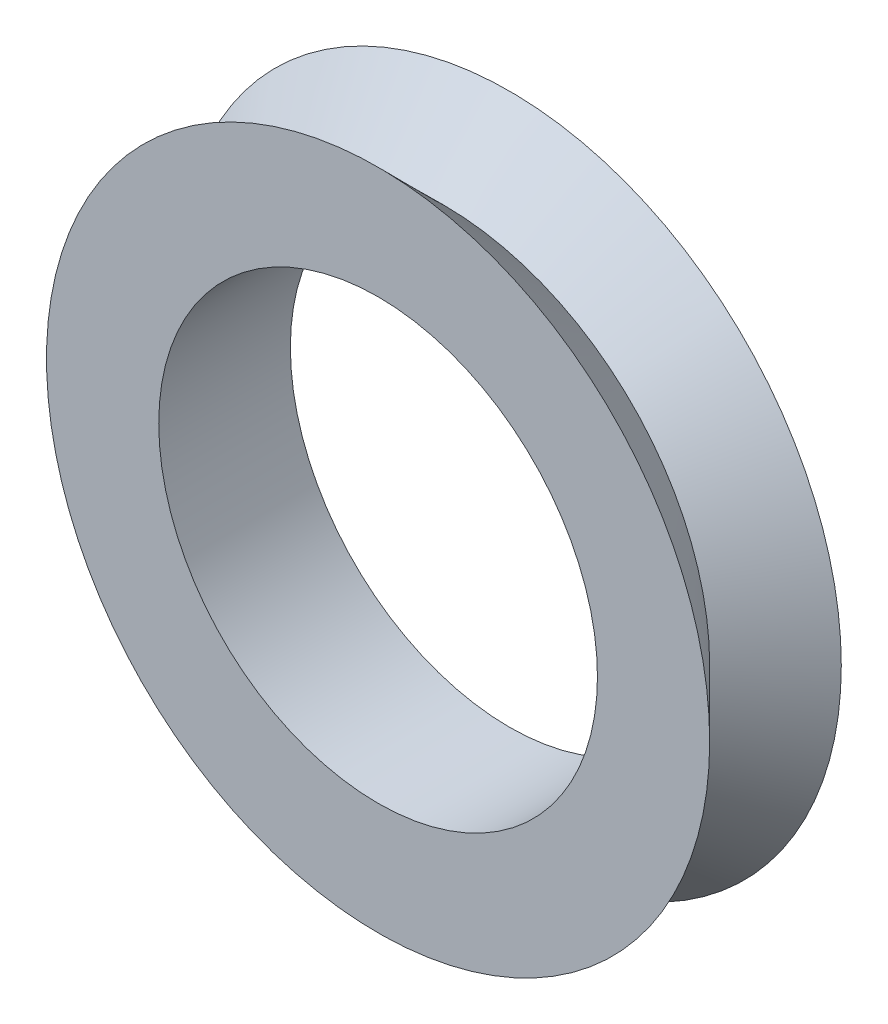
ISO-10303-21;
HEADER;
FILE_DESCRIPTION(('STEP AP214'),'2;1');
FILE_NAME('part.step','',(''),(''),'','','');
FILE_SCHEMA(('AUTOMOTIVE_DESIGN { 1 0 10303 214 1 1 1 1 }'));
ENDSEC;
DATA;
#1=APPLICATION_CONTEXT('core data for automotive mechanical design processes');
#2=APPLICATION_PROTOCOL_DEFINITION('international standard','automotive_design',2000,#1);
#3=PRODUCT_CONTEXT('',#1,'mechanical');
#4=PRODUCT('Part','Part','',(#3));
#5=PRODUCT_RELATED_PRODUCT_CATEGORY('part','',(#4));
#6=PRODUCT_DEFINITION_FORMATION('','',#4);
#7=PRODUCT_DEFINITION_CONTEXT('part definition',#1,'design');
#8=PRODUCT_DEFINITION('design','',#6,#7);
#9=PRODUCT_DEFINITION_SHAPE('','',#8);
#10=(LENGTH_UNIT() NAMED_UNIT(*) SI_UNIT(.MILLI.,.METRE.));
#11=(NAMED_UNIT(*) PLANE_ANGLE_UNIT() SI_UNIT($,.RADIAN.));
#12=(NAMED_UNIT(*) SI_UNIT($,.STERADIAN.) SOLID_ANGLE_UNIT());
#13=UNCERTAINTY_MEASURE_WITH_UNIT(LENGTH_MEASURE(1.E-05),#10,'distance_accuracy_value','');
#14=(GEOMETRIC_REPRESENTATION_CONTEXT(3) GLOBAL_UNCERTAINTY_ASSIGNED_CONTEXT((#13)) GLOBAL_UNIT_ASSIGNED_CONTEXT((#10,
#11,#12)) REPRESENTATION_CONTEXT('',''));
#15=CARTESIAN_POINT('',(0.,0.,0.));
#16=DIRECTION('',(0.,0.,1.));
#17=DIRECTION('',(1.,0.,0.));
#18=AXIS2_PLACEMENT_3D('',#15,#16,#17);
#19=CARTESIAN_POINT('',(0.,0.,4.5));
#20=DIRECTION('',(0.,0.,-1.));
#21=DIRECTION('',(-1.,0.,0.));
#22=AXIS2_PLACEMENT_3D('',#19,#20,#21);
#23=PLANE('',#22);
#24=CARTESIAN_POINT('',(0.,0.,4.5));
#25=DIRECTION('',(0.,0.,1.));
#26=DIRECTION('',(1.,0.,0.));
#27=AXIS2_PLACEMENT_3D('',#24,#25,#26);
#28=CIRCLE('',#27,15.);
#29=CARTESIAN_POINT('',(15.,0.,4.5));
#30=VERTEX_POINT('',#29);
#31=EDGE_CURVE('E10',#30,#30,#28,.T.);
#32=ORIENTED_EDGE('',*,*,#31,.F.);
#33=EDGE_LOOP('',(#32));
#34=FACE_BOUND('',#33,.T.);
#35=CARTESIAN_POINT('',(0.,0.,4.5));
#36=DIRECTION('',(0.,0.,1.));
#37=DIRECTION('',(1.,0.,0.));
#38=AXIS2_PLACEMENT_3D('',#35,#36,#37);
#39=CIRCLE('',#38,22.6749999999999);
#40=CARTESIAN_POINT('',(22.6749999999999,0.,4.5));
#41=VERTEX_POINT('',#40);
#42=EDGE_CURVE('E52',#41,#41,#39,.T.);
#43=ORIENTED_EDGE('',*,*,#42,.T.);
#44=EDGE_LOOP('',(#43));
#45=FACE_BOUND('',#44,.T.);
#46=ADVANCED_FACE('F33',(#34,#45),#23,.F.);
#47=CARTESIAN_POINT('',(0.,0.,-6.58007714250792));
#48=DIRECTION('',(0.,0.,1.));
#49=DIRECTION('',(1.,0.,0.));
#50=AXIS2_PLACEMENT_3D('',#47,#48,#49);
#51=CYLINDRICAL_SURFACE('',#50,15.);
#52=CARTESIAN_POINT('',(0.,0.,-4.5));
#53=DIRECTION('',(0.,0.,1.));
#54=DIRECTION('',(1.,0.,0.));
#55=AXIS2_PLACEMENT_3D('',#52,#53,#54);
#56=CIRCLE('',#55,15.);
#57=CARTESIAN_POINT('',(15.,0.,-4.5));
#58=VERTEX_POINT('',#57);
#59=EDGE_CURVE('E39',#58,#58,#56,.T.);
#60=ORIENTED_EDGE('',*,*,#59,.F.);
#61=EDGE_LOOP('',(#60));
#62=FACE_BOUND('',#61,.T.);
#63=ORIENTED_EDGE('',*,*,#31,.T.);
#64=EDGE_LOOP('',(#63));
#65=FACE_BOUND('',#64,.T.);
#66=ADVANCED_FACE('F71',(#62,#65),#51,.F.);
#67=CARTESIAN_POINT('',(0.,0.,-4.5));
#68=DIRECTION('',(0.,0.,1.));
#69=DIRECTION('',(1.,0.,0.));
#70=AXIS2_PLACEMENT_3D('',#67,#68,#69);
#71=PLANE('',#70);
#72=CARTESIAN_POINT('',(0.,0.,-4.5));
#73=DIRECTION('',(0.,0.,1.));
#74=DIRECTION('',(1.,0.,0.));
#75=AXIS2_PLACEMENT_3D('',#72,#73,#74);
#76=CIRCLE('',#75,22.6749999999999);
#77=CARTESIAN_POINT('',(22.6749999999999,0.,-4.5));
#78=VERTEX_POINT('',#77);
#79=EDGE_CURVE('E43',#78,#78,#76,.T.);
#80=ORIENTED_EDGE('',*,*,#79,.F.);
#81=EDGE_LOOP('',(#80));
#82=FACE_BOUND('',#81,.T.);
#83=ORIENTED_EDGE('',*,*,#59,.T.);
#84=EDGE_LOOP('',(#83));
#85=FACE_BOUND('',#84,.T.);
#86=ADVANCED_FACE('F65',(#82,#85),#71,.F.);
#87=CARTESIAN_POINT('',(0.,0.,0.));
#88=DIRECTION('',(0.,0.,-1.));
#89=DIRECTION('',(-1.,0.,0.));
#90=AXIS2_PLACEMENT_3D('',#87,#88,#89);
#91=CONICAL_SURFACE('',#90,18.175,0.785398163397443);
#92=ORIENTED_EDGE('',*,*,#79,.T.);
#93=EDGE_LOOP('',(#92));
#94=FACE_BOUND('',#93,.T.);
#95=CARTESIAN_POINT('',(0.,0.,0.));
#96=DIRECTION('',(0.,0.,1.));
#97=DIRECTION('',(1.,0.,0.));
#98=AXIS2_PLACEMENT_3D('',#95,#96,#97);
#99=CIRCLE('',#98,18.175);
#100=CARTESIAN_POINT('',(18.175,0.,0.));
#101=VERTEX_POINT('',#100);
#102=EDGE_CURVE('E47',#101,#101,#99,.T.);
#103=ORIENTED_EDGE('',*,*,#102,.F.);
#104=EDGE_LOOP('',(#103));
#105=FACE_BOUND('',#104,.T.);
#106=ADVANCED_FACE('F60',(#94,#105),#91,.T.);
#107=CARTESIAN_POINT('',(0.,0.,0.));
#108=DIRECTION('',(0.,0.,1.));
#109=DIRECTION('',(1.,0.,0.));
#110=AXIS2_PLACEMENT_3D('',#107,#108,#109);
#111=CONICAL_SURFACE('',#110,18.175,0.785398163397443);
#112=ORIENTED_EDGE('',*,*,#42,.F.);
#113=EDGE_LOOP('',(#112));
#114=FACE_BOUND('',#113,.T.);
#115=ORIENTED_EDGE('',*,*,#102,.T.);
#116=EDGE_LOOP('',(#115));
#117=FACE_BOUND('',#116,.T.);
#118=ADVANCED_FACE('F57',(#114,#117),#111,.T.);
#119=CLOSED_SHELL('',(#46,#66,#86,#106,#118));
#120=MANIFOLD_SOLID_BREP('B2',#119);
#121=ADVANCED_BREP_SHAPE_REPRESENTATION('',(#18,#120),#14);
#122=SHAPE_DEFINITION_REPRESENTATION(#9,#121);
ENDSEC;
END-ISO-10303-21;
